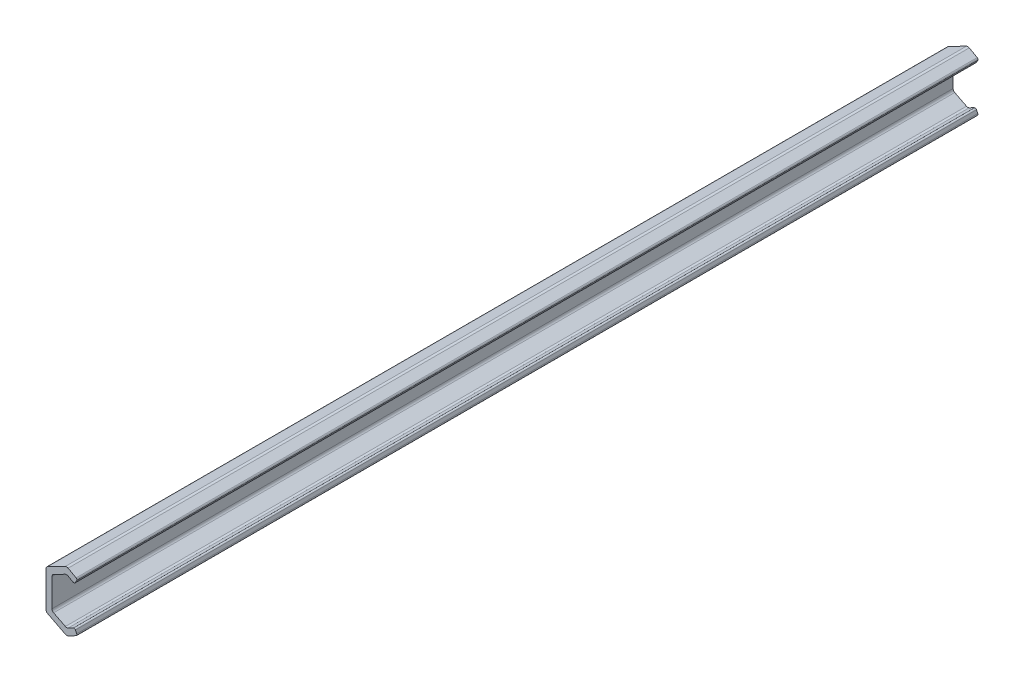
ISO-10303-21;
HEADER;
FILE_DESCRIPTION(('STEP AP214'),'2;1');
FILE_NAME('part.step','',(''),(''),'','','');
FILE_SCHEMA(('AUTOMOTIVE_DESIGN { 1 0 10303 214 1 1 1 1 }'));
ENDSEC;
DATA;
#1=APPLICATION_CONTEXT('core data for automotive mechanical design processes');
#2=APPLICATION_PROTOCOL_DEFINITION('international standard','automotive_design',2000,#1);
#3=PRODUCT_CONTEXT('',#1,'mechanical');
#4=PRODUCT('Part','Part','',(#3));
#5=PRODUCT_RELATED_PRODUCT_CATEGORY('part','',(#4));
#6=PRODUCT_DEFINITION_FORMATION('','',#4);
#7=PRODUCT_DEFINITION_CONTEXT('part definition',#1,'design');
#8=PRODUCT_DEFINITION('design','',#6,#7);
#9=PRODUCT_DEFINITION_SHAPE('','',#8);
#10=(LENGTH_UNIT() NAMED_UNIT(*) SI_UNIT(.MILLI.,.METRE.));
#11=(NAMED_UNIT(*) PLANE_ANGLE_UNIT() SI_UNIT($,.RADIAN.));
#12=(NAMED_UNIT(*) SI_UNIT($,.STERADIAN.) SOLID_ANGLE_UNIT());
#13=UNCERTAINTY_MEASURE_WITH_UNIT(LENGTH_MEASURE(1.E-05),#10,'distance_accuracy_value','');
#14=(GEOMETRIC_REPRESENTATION_CONTEXT(3) GLOBAL_UNCERTAINTY_ASSIGNED_CONTEXT((#13)) GLOBAL_UNIT_ASSIGNED_CONTEXT((#10,
#11,#12)) REPRESENTATION_CONTEXT('',''));
#15=CARTESIAN_POINT('',(0.,0.,0.));
#16=DIRECTION('',(0.,0.,1.));
#17=DIRECTION('',(1.,0.,0.));
#18=AXIS2_PLACEMENT_3D('',#15,#16,#17);
#19=CARTESIAN_POINT('',(-88.2947227276455,31.2363335950971,300.));
#20=DIRECTION('',(0.,0.,-1.));
#21=DIRECTION('',(-1.,0.,0.));
#22=AXIS2_PLACEMENT_3D('',#19,#20,#21);
#23=CYLINDRICAL_SURFACE('',#22,1.00000000000001);
#24=CARTESIAN_POINT('',(-88.2947227276455,31.2363335950971,0.));
#25=DIRECTION('',(0.,0.,1.));
#26=DIRECTION('',(1.,0.,0.));
#27=AXIS2_PLACEMENT_3D('',#24,#25,#26);
#28=CIRCLE('',#27,1.00000000000001);
#29=CARTESIAN_POINT('',(-88.7470988650902,32.128160837488,0.));
#30=VERTEX_POINT('',#29);
#31=CARTESIAN_POINT('',(-89.2947227276455,31.2363335950971,0.));
#32=VERTEX_POINT('',#31);
#33=EDGE_CURVE('E227',#30,#32,#28,.T.);
#34=ORIENTED_EDGE('',*,*,#33,.F.);
#35=DIRECTION('',(0.,0.,-1.));
#36=VECTOR('',#35,1.);
#37=CARTESIAN_POINT('',(-88.7470988650902,32.128160837488,300.));
#38=LINE('',#37,#36);
#39=CARTESIAN_POINT('',(-88.7470988650902,32.128160837488,300.));
#40=VERTEX_POINT('',#39);
#41=EDGE_CURVE('E11',#40,#30,#38,.T.);
#42=ORIENTED_EDGE('',*,*,#41,.F.);
#43=CARTESIAN_POINT('',(-88.2947227276455,31.2363335950971,300.));
#44=DIRECTION('',(0.,0.,1.));
#45=DIRECTION('',(1.,0.,0.));
#46=AXIS2_PLACEMENT_3D('',#43,#44,#45);
#47=CIRCLE('',#46,1.00000000000001);
#48=CARTESIAN_POINT('',(-89.2947227276455,31.2363335950971,300.));
#49=VERTEX_POINT('',#48);
#50=EDGE_CURVE('E288',#40,#49,#47,.T.);
#51=ORIENTED_EDGE('',*,*,#50,.T.);
#52=DIRECTION('',(0.,0.,-1.));
#53=VECTOR('',#52,1.);
#54=CARTESIAN_POINT('',(-89.2947227276455,31.2363335950971,300.));
#55=LINE('',#54,#53);
#56=EDGE_CURVE('E39',#49,#32,#55,.T.);
#57=ORIENTED_EDGE('',*,*,#56,.T.);
#58=EDGE_LOOP('',(#34,#42,#51,#57));
#59=FACE_BOUND('',#58,.T.);
#60=ADVANCED_FACE('F36',(#59),#23,.F.);
#61=CARTESIAN_POINT('',(-88.7470988650902,32.128160837488,300.));
#62=DIRECTION('',(-0.452376137444682,0.891827242390941,0.));
#63=DIRECTION('',(-0.891827242390941,-0.452376137444682,0.));
#64=AXIS2_PLACEMENT_3D('',#61,#62,#63);
#65=PLANE('',#64);
#66=DIRECTION('',(0.891827242390941,0.452376137444682,0.));
#67=VECTOR('',#66,1.);
#68=CARTESIAN_POINT('',(-88.7470988650902,32.128160837488,0.));
#69=LINE('',#68,#67);
#70=CARTESIAN_POINT('',(-84.9054833342763,34.0768063965965,0.));
#71=VERTEX_POINT('',#70);
#72=EDGE_CURVE('E287',#30,#71,#69,.T.);
#73=ORIENTED_EDGE('',*,*,#72,.T.);
#74=DIRECTION('',(0.,0.,-1.));
#75=VECTOR('',#74,1.);
#76=CARTESIAN_POINT('',(-84.9054833342763,34.0768063965965,300.));
#77=LINE('',#76,#75);
#78=CARTESIAN_POINT('',(-84.9054833342763,34.0768063965965,300.));
#79=VERTEX_POINT('',#78);
#80=EDGE_CURVE('E45',#79,#71,#77,.T.);
#81=ORIENTED_EDGE('',*,*,#80,.F.);
#82=DIRECTION('',(0.891827242390941,0.452376137444682,0.));
#83=VECTOR('',#82,1.);
#84=CARTESIAN_POINT('',(-88.7470988650902,32.128160837488,300.));
#85=LINE('',#84,#83);
#86=EDGE_CURVE('E222',#40,#79,#85,.T.);
#87=ORIENTED_EDGE('',*,*,#86,.F.);
#88=ORIENTED_EDGE('',*,*,#41,.T.);
#89=EDGE_LOOP('',(#73,#81,#87,#88));
#90=FACE_BOUND('',#89,.T.);
#91=ADVANCED_FACE('F338',(#90),#65,.F.);
#92=CARTESIAN_POINT('',(-84.4531071968316,33.1849791542056,300.));
#93=DIRECTION('',(0.,0.,-1.));
#94=DIRECTION('',(-1.,0.,0.));
#95=AXIS2_PLACEMENT_3D('',#92,#93,#94);
#96=CYLINDRICAL_SURFACE('',#95,1.);
#97=CARTESIAN_POINT('',(-84.4531071968316,33.1849791542056,0.));
#98=DIRECTION('',(0.,0.,1.));
#99=DIRECTION('',(1.,0.,0.));
#100=AXIS2_PLACEMENT_3D('',#97,#98,#99);
#101=CIRCLE('',#100,1.);
#102=CARTESIAN_POINT('',(-83.9691158121345,34.0600519166311,0.));
#103=VERTEX_POINT('',#102);
#104=EDGE_CURVE('E207',#103,#71,#101,.T.);
#105=ORIENTED_EDGE('',*,*,#104,.F.);
#106=DIRECTION('',(0.,0.,-1.));
#107=VECTOR('',#106,1.);
#108=CARTESIAN_POINT('',(-83.9691158121345,34.0600519166311,300.));
#109=LINE('',#108,#107);
#110=CARTESIAN_POINT('',(-83.9691158121345,34.0600519166311,300.));
#111=VERTEX_POINT('',#110);
#112=EDGE_CURVE('E201',#111,#103,#109,.T.);
#113=ORIENTED_EDGE('',*,*,#112,.F.);
#114=CARTESIAN_POINT('',(-84.4531071968316,33.1849791542056,300.));
#115=DIRECTION('',(0.,0.,1.));
#116=DIRECTION('',(1.,0.,0.));
#117=AXIS2_PLACEMENT_3D('',#114,#115,#116);
#118=CIRCLE('',#117,1.);
#119=EDGE_CURVE('E205',#111,#79,#118,.T.);
#120=ORIENTED_EDGE('',*,*,#119,.T.);
#121=ORIENTED_EDGE('',*,*,#80,.T.);
#122=EDGE_LOOP('',(#105,#113,#120,#121));
#123=FACE_BOUND('',#122,.T.);
#124=ADVANCED_FACE('F203',(#123),#96,.F.);
#125=CARTESIAN_POINT('',(-83.9691158121345,34.0600519166311,300.));
#126=DIRECTION('',(0.483991384697101,0.875072762425493,0.));
#127=DIRECTION('',(-0.875072762425493,0.483991384697101,0.));
#128=AXIS2_PLACEMENT_3D('',#125,#126,#127);
#129=PLANE('',#128);
#130=DIRECTION('',(0.875072762425493,-0.483991384697101,0.));
#131=VECTOR('',#130,1.);
#132=CARTESIAN_POINT('',(-83.9691158121345,34.0600519166311,0.));
#133=LINE('',#132,#131);
#134=CARTESIAN_POINT('',(-82.247884937723,33.1080614650248,0.));
#135=VERTEX_POINT('',#134);
#136=EDGE_CURVE('E284',#103,#135,#133,.T.);
#137=ORIENTED_EDGE('',*,*,#136,.T.);
#138=DIRECTION('',(0.,0.,-1.));
#139=VECTOR('',#138,1.);
#140=CARTESIAN_POINT('',(-82.247884937723,33.1080614650248,300.));
#141=LINE('',#140,#139);
#142=CARTESIAN_POINT('',(-82.247884937723,33.1080614650248,300.));
#143=VERTEX_POINT('',#142);
#144=EDGE_CURVE('E210',#143,#135,#141,.T.);
#145=ORIENTED_EDGE('',*,*,#144,.F.);
#146=DIRECTION('',(0.875072762425493,-0.483991384697101,0.));
#147=VECTOR('',#146,1.);
#148=CARTESIAN_POINT('',(-83.9691158121345,34.0600519166311,300.));
#149=LINE('',#148,#147);
#150=EDGE_CURVE('E213',#111,#143,#149,.T.);
#151=ORIENTED_EDGE('',*,*,#150,.F.);
#152=ORIENTED_EDGE('',*,*,#112,.T.);
#153=EDGE_LOOP('',(#137,#145,#151,#152));
#154=FACE_BOUND('',#153,.T.);
#155=ADVANCED_FACE('F214',(#154),#129,.F.);
#156=CARTESIAN_POINT('',(-82.0058892453745,33.5455978462375,300.));
#157=DIRECTION('',(0.,0.,-1.));
#158=DIRECTION('',(-1.,0.,0.));
#159=AXIS2_PLACEMENT_3D('',#156,#157,#158);
#160=CYLINDRICAL_SURFACE('',#159,0.499999999999997);
#161=CARTESIAN_POINT('',(-82.0058892453745,33.5455978462375,0.));
#162=DIRECTION('',(0.,0.,1.));
#163=DIRECTION('',(1.,0.,0.));
#164=AXIS2_PLACEMENT_3D('',#161,#162,#163);
#165=CIRCLE('',#164,0.499999999999997);
#166=CARTESIAN_POINT('',(-81.5683528641617,33.303602153889,0.));
#167=VERTEX_POINT('',#166);
#168=EDGE_CURVE('E281',#135,#167,#165,.T.);
#169=ORIENTED_EDGE('',*,*,#168,.T.);
#170=DIRECTION('',(0.,0.,-1.));
#171=VECTOR('',#170,1.);
#172=CARTESIAN_POINT('',(-81.5683528641617,33.303602153889,300.));
#173=LINE('',#172,#171);
#174=CARTESIAN_POINT('',(-81.5683528641617,33.303602153889,300.));
#175=VERTEX_POINT('',#174);
#176=EDGE_CURVE('E292',#175,#167,#173,.T.);
#177=ORIENTED_EDGE('',*,*,#176,.F.);
#178=CARTESIAN_POINT('',(-82.0058892453745,33.5455978462375,300.));
#179=DIRECTION('',(0.,0.,1.));
#180=DIRECTION('',(1.,0.,0.));
#181=AXIS2_PLACEMENT_3D('',#178,#179,#180);
#182=CIRCLE('',#181,0.499999999999997);
#183=EDGE_CURVE('E218',#143,#175,#182,.T.);
#184=ORIENTED_EDGE('',*,*,#183,.F.);
#185=ORIENTED_EDGE('',*,*,#144,.T.);
#186=EDGE_LOOP('',(#169,#177,#184,#185));
#187=FACE_BOUND('',#186,.T.);
#188=ADVANCED_FACE('F394',(#187),#160,.T.);
#189=CARTESIAN_POINT('',(-81.0843614794646,34.1786749163145,300.));
#190=DIRECTION('',(0.875072762425488,-0.48399138469711,0.));
#191=DIRECTION('',(0.48399138469711,0.875072762425488,0.));
#192=AXIS2_PLACEMENT_3D('',#189,#190,#191);
#193=PLANE('',#192);
#194=DIRECTION('',(-0.48399138469711,-0.875072762425488,0.));
#195=VECTOR('',#194,1.);
#196=CARTESIAN_POINT('',(-81.0843614794646,34.1786749163145,0.));
#197=LINE('',#196,#195);
#198=CARTESIAN_POINT('',(-81.0843614794646,34.1786749163145,0.));
#199=VERTEX_POINT('',#198);
#200=EDGE_CURVE('E278',#199,#167,#197,.T.);
#201=ORIENTED_EDGE('',*,*,#200,.F.);
#202=DIRECTION('',(0.,0.,-1.));
#203=VECTOR('',#202,1.);
#204=CARTESIAN_POINT('',(-81.0843614794646,34.1786749163145,300.));
#205=LINE('',#204,#203);
#206=CARTESIAN_POINT('',(-81.0843614794646,34.1786749163145,300.));
#207=VERTEX_POINT('',#206);
#208=EDGE_CURVE('E294',#207,#199,#205,.T.);
#209=ORIENTED_EDGE('',*,*,#208,.F.);
#210=DIRECTION('',(-0.48399138469711,-0.875072762425488,0.));
#211=VECTOR('',#210,1.);
#212=CARTESIAN_POINT('',(-81.0843614794646,34.1786749163145,300.));
#213=LINE('',#212,#211);
#214=EDGE_CURVE('E388',#207,#175,#213,.T.);
#215=ORIENTED_EDGE('',*,*,#214,.T.);
#216=ORIENTED_EDGE('',*,*,#176,.T.);
#217=EDGE_LOOP('',(#201,#209,#215,#216));
#218=FACE_BOUND('',#217,.T.);
#219=ADVANCED_FACE('F398',(#218),#193,.T.);
#220=CARTESIAN_POINT('',(-81.5218978606774,34.420670608663,300.));
#221=DIRECTION('',(0.,0.,-1.));
#222=DIRECTION('',(-1.,0.,0.));
#223=AXIS2_PLACEMENT_3D('',#220,#221,#222);
#224=CYLINDRICAL_SURFACE('',#223,0.499999999999999);
#225=CARTESIAN_POINT('',(-81.5218978606774,34.420670608663,0.));
#226=DIRECTION('',(0.,0.,-1.));
#227=DIRECTION('',(-1.,0.,0.));
#228=AXIS2_PLACEMENT_3D('',#225,#226,#227);
#229=CIRCLE('',#228,0.499999999999999);
#230=CARTESIAN_POINT('',(-81.2799021683288,34.8582069898758,0.));
#231=VERTEX_POINT('',#230);
#232=EDGE_CURVE('E275',#231,#199,#229,.T.);
#233=ORIENTED_EDGE('',*,*,#232,.F.);
#234=DIRECTION('',(0.,0.,-1.));
#235=VECTOR('',#234,1.);
#236=CARTESIAN_POINT('',(-81.2799021683288,34.8582069898758,300.));
#237=LINE('',#236,#235);
#238=CARTESIAN_POINT('',(-81.2799021683288,34.8582069898758,300.));
#239=VERTEX_POINT('',#238);
#240=EDGE_CURVE('E296',#239,#231,#237,.T.);
#241=ORIENTED_EDGE('',*,*,#240,.F.);
#242=CARTESIAN_POINT('',(-81.5218978606774,34.420670608663,300.));
#243=DIRECTION('',(0.,0.,-1.));
#244=DIRECTION('',(-1.,0.,0.));
#245=AXIS2_PLACEMENT_3D('',#242,#243,#244);
#246=CIRCLE('',#245,0.499999999999999);
#247=EDGE_CURVE('E385',#239,#207,#246,.T.);
#248=ORIENTED_EDGE('',*,*,#247,.T.);
#249=ORIENTED_EDGE('',*,*,#208,.T.);
#250=EDGE_LOOP('',(#233,#241,#248,#249));
#251=FACE_BOUND('',#250,.T.);
#252=ADVANCED_FACE('F401',(#251),#224,.T.);
#253=CARTESIAN_POINT('',(-83.9286215389908,36.3231792880964,300.));
#254=DIRECTION('',(0.483991384697101,0.875072762425493,0.));
#255=DIRECTION('',(-0.875072762425493,0.483991384697101,0.));
#256=AXIS2_PLACEMENT_3D('',#253,#254,#255);
#257=PLANE('',#256);
#258=DIRECTION('',(0.875072762425493,-0.483991384697101,0.));
#259=VECTOR('',#258,1.);
#260=CARTESIAN_POINT('',(-83.9286215389908,36.3231792880964,0.));
#261=LINE('',#260,#259);
#262=CARTESIAN_POINT('',(-83.9286215389908,36.3231792880964,0.));
#263=VERTEX_POINT('',#262);
#264=EDGE_CURVE('E272',#263,#231,#261,.T.);
#265=ORIENTED_EDGE('',*,*,#264,.F.);
#266=DIRECTION('',(0.,0.,-1.));
#267=VECTOR('',#266,1.);
#268=CARTESIAN_POINT('',(-83.9286215389908,36.3231792880964,300.));
#269=LINE('',#268,#267);
#270=CARTESIAN_POINT('',(-83.9286215389908,36.3231792880964,300.));
#271=VERTEX_POINT('',#270);
#272=EDGE_CURVE('E298',#271,#263,#269,.T.);
#273=ORIENTED_EDGE('',*,*,#272,.F.);
#274=DIRECTION('',(0.875072762425493,-0.483991384697101,0.));
#275=VECTOR('',#274,1.);
#276=CARTESIAN_POINT('',(-83.9286215389908,36.3231792880964,300.));
#277=LINE('',#276,#275);
#278=EDGE_CURVE('E382',#271,#239,#277,.T.);
#279=ORIENTED_EDGE('',*,*,#278,.T.);
#280=ORIENTED_EDGE('',*,*,#240,.T.);
#281=EDGE_LOOP('',(#265,#273,#279,#280));
#282=FACE_BOUND('',#281,.T.);
#283=ADVANCED_FACE('F406',(#282),#257,.T.);
#284=CARTESIAN_POINT('',(-84.4126129236879,35.4481065256709,300.));
#285=DIRECTION('',(0.,0.,-1.));
#286=DIRECTION('',(-1.,0.,0.));
#287=AXIS2_PLACEMENT_3D('',#284,#285,#286);
#288=CYLINDRICAL_SURFACE('',#287,1.);
#289=CARTESIAN_POINT('',(-84.4126129236879,35.4481065256709,0.));
#290=DIRECTION('',(0.,0.,-1.));
#291=DIRECTION('',(-1.,0.,0.));
#292=AXIS2_PLACEMENT_3D('',#289,#290,#291);
#293=CIRCLE('',#292,1.);
#294=CARTESIAN_POINT('',(-84.8649890611326,36.3399337680618,0.));
#295=VERTEX_POINT('',#294);
#296=EDGE_CURVE('E269',#295,#263,#293,.T.);
#297=ORIENTED_EDGE('',*,*,#296,.F.);
#298=DIRECTION('',(0.,0.,-1.));
#299=VECTOR('',#298,1.);
#300=CARTESIAN_POINT('',(-84.8649890611326,36.3399337680618,300.));
#301=LINE('',#300,#299);
#302=CARTESIAN_POINT('',(-84.8649890611326,36.3399337680618,300.));
#303=VERTEX_POINT('',#302);
#304=EDGE_CURVE('E300',#303,#295,#301,.T.);
#305=ORIENTED_EDGE('',*,*,#304,.F.);
#306=CARTESIAN_POINT('',(-84.4126129236879,35.4481065256709,300.));
#307=DIRECTION('',(0.,0.,-1.));
#308=DIRECTION('',(-1.,0.,0.));
#309=AXIS2_PLACEMENT_3D('',#306,#307,#308);
#310=CIRCLE('',#309,1.);
#311=EDGE_CURVE('E379',#303,#271,#310,.T.);
#312=ORIENTED_EDGE('',*,*,#311,.T.);
#313=ORIENTED_EDGE('',*,*,#272,.T.);
#314=EDGE_LOOP('',(#297,#305,#312,#313));
#315=FACE_BOUND('',#314,.T.);
#316=ADVANCED_FACE('F409',(#315),#288,.T.);
#317=CARTESIAN_POINT('',(-90.7470988650902,33.3562548819964,300.));
#318=DIRECTION('',(-0.452376137444682,0.891827242390941,0.));
#319=DIRECTION('',(-0.891827242390941,-0.452376137444682,0.));
#320=AXIS2_PLACEMENT_3D('',#317,#318,#319);
#321=PLANE('',#320);
#322=DIRECTION('',(0.891827242390941,0.452376137444682,0.));
#323=VECTOR('',#322,1.);
#324=CARTESIAN_POINT('',(-90.7470988650902,33.3562548819964,0.));
#325=LINE('',#324,#323);
#326=CARTESIAN_POINT('',(-90.7470988650902,33.3562548819964,0.));
#327=VERTEX_POINT('',#326);
#328=EDGE_CURVE('E266',#327,#295,#325,.T.);
#329=ORIENTED_EDGE('',*,*,#328,.F.);
#330=DIRECTION('',(0.,0.,-1.));
#331=VECTOR('',#330,1.);
#332=CARTESIAN_POINT('',(-90.7470988650902,33.3562548819964,300.));
#333=LINE('',#332,#331);
#334=CARTESIAN_POINT('',(-90.7470988650902,33.3562548819964,300.));
#335=VERTEX_POINT('',#334);
#336=EDGE_CURVE('E302',#335,#327,#333,.T.);
#337=ORIENTED_EDGE('',*,*,#336,.F.);
#338=DIRECTION('',(0.891827242390941,0.452376137444682,0.));
#339=VECTOR('',#338,1.);
#340=CARTESIAN_POINT('',(-90.7470988650902,33.3562548819964,300.));
#341=LINE('',#340,#339);
#342=EDGE_CURVE('E376',#335,#303,#341,.T.);
#343=ORIENTED_EDGE('',*,*,#342,.T.);
#344=ORIENTED_EDGE('',*,*,#304,.T.);
#345=EDGE_LOOP('',(#329,#337,#343,#344));
#346=FACE_BOUND('',#345,.T.);
#347=ADVANCED_FACE('F414',(#346),#321,.T.);
#348=CARTESIAN_POINT('',(-90.2947227276455,32.4644276396054,300.));
#349=DIRECTION('',(0.,0.,-1.));
#350=DIRECTION('',(-1.,0.,0.));
#351=AXIS2_PLACEMENT_3D('',#348,#349,#350);
#352=CYLINDRICAL_SURFACE('',#351,1.00000000000001);
#353=CARTESIAN_POINT('',(-90.2947227276455,32.4644276396054,0.));
#354=DIRECTION('',(0.,0.,-1.));
#355=DIRECTION('',(-1.,0.,0.));
#356=AXIS2_PLACEMENT_3D('',#353,#354,#355);
#357=CIRCLE('',#356,1.00000000000001);
#358=CARTESIAN_POINT('',(-91.2947227276455,32.4644276396054,0.));
#359=VERTEX_POINT('',#358);
#360=EDGE_CURVE('E263',#359,#327,#357,.T.);
#361=ORIENTED_EDGE('',*,*,#360,.F.);
#362=DIRECTION('',(0.,0.,-1.));
#363=VECTOR('',#362,1.);
#364=CARTESIAN_POINT('',(-91.2947227276455,32.4644276396054,300.));
#365=LINE('',#364,#363);
#366=CARTESIAN_POINT('',(-91.2947227276455,32.4644276396054,300.));
#367=VERTEX_POINT('',#366);
#368=EDGE_CURVE('E304',#367,#359,#365,.T.);
#369=ORIENTED_EDGE('',*,*,#368,.F.);
#370=CARTESIAN_POINT('',(-90.2947227276455,32.4644276396054,300.));
#371=DIRECTION('',(0.,0.,-1.));
#372=DIRECTION('',(-1.,0.,0.));
#373=AXIS2_PLACEMENT_3D('',#370,#371,#372);
#374=CIRCLE('',#373,1.00000000000001);
#375=EDGE_CURVE('E373',#367,#335,#374,.T.);
#376=ORIENTED_EDGE('',*,*,#375,.T.);
#377=ORIENTED_EDGE('',*,*,#336,.T.);
#378=EDGE_LOOP('',(#361,#369,#376,#377));
#379=FACE_BOUND('',#378,.T.);
#380=ADVANCED_FACE('F417',(#379),#352,.T.);
#381=CARTESIAN_POINT('',(-91.2947227276455,32.4644276396054,300.));
#382=DIRECTION('',(1.,0.,0.));
#383=DIRECTION('',(0.,1.,0.));
#384=AXIS2_PLACEMENT_3D('',#381,#382,#383);
#385=PLANE('',#384);
#386=DIRECTION('',(0.,-1.,0.));
#387=VECTOR('',#386,1.);
#388=CARTESIAN_POINT('',(-91.2947227276455,32.4644276396054,0.));
#389=LINE('',#388,#387);
#390=CARTESIAN_POINT('',(-91.2947227276455,20.6949127832017,0.));
#391=VERTEX_POINT('',#390);
#392=EDGE_CURVE('E261',#359,#391,#389,.T.);
#393=ORIENTED_EDGE('',*,*,#392,.T.);
#394=DIRECTION('',(0.,0.,-1.));
#395=VECTOR('',#394,1.);
#396=CARTESIAN_POINT('',(-91.2947227276455,20.6949127832017,300.));
#397=LINE('',#396,#395);
#398=CARTESIAN_POINT('',(-91.2947227276455,20.6949127832017,300.));
#399=VERTEX_POINT('',#398);
#400=EDGE_CURVE('E306',#399,#391,#397,.T.);
#401=ORIENTED_EDGE('',*,*,#400,.F.);
#402=DIRECTION('',(0.,-1.,0.));
#403=VECTOR('',#402,1.);
#404=CARTESIAN_POINT('',(-91.2947227276455,32.4644276396054,300.));
#405=LINE('',#404,#403);
#406=EDGE_CURVE('E371',#367,#399,#405,.T.);
#407=ORIENTED_EDGE('',*,*,#406,.F.);
#408=ORIENTED_EDGE('',*,*,#368,.T.);
#409=EDGE_LOOP('',(#393,#401,#407,#408));
#410=FACE_BOUND('',#409,.T.);
#411=ADVANCED_FACE('F423',(#410),#385,.F.);
#412=CARTESIAN_POINT('',(-90.2947227276455,20.6949127832017,300.));
#413=DIRECTION('',(0.,0.,-1.));
#414=DIRECTION('',(-1.,0.,0.));
#415=AXIS2_PLACEMENT_3D('',#412,#413,#414);
#416=CYLINDRICAL_SURFACE('',#415,1.);
#417=CARTESIAN_POINT('',(-90.2947227276455,20.6949127832017,0.));
#418=DIRECTION('',(0.,0.,1.));
#419=DIRECTION('',(1.,0.,0.));
#420=AXIS2_PLACEMENT_3D('',#417,#418,#419);
#421=CIRCLE('',#420,1.);
#422=CARTESIAN_POINT('',(-90.7470988650902,19.8030855408107,0.));
#423=VERTEX_POINT('',#422);
#424=EDGE_CURVE('E259',#391,#423,#421,.T.);
#425=ORIENTED_EDGE('',*,*,#424,.T.);
#426=DIRECTION('',(0.,0.,-1.));
#427=VECTOR('',#426,1.);
#428=CARTESIAN_POINT('',(-90.7470988650902,19.8030855408107,300.));
#429=LINE('',#428,#427);
#430=CARTESIAN_POINT('',(-90.7470988650902,19.8030855408107,300.));
#431=VERTEX_POINT('',#430);
#432=EDGE_CURVE('E309',#431,#423,#429,.T.);
#433=ORIENTED_EDGE('',*,*,#432,.F.);
#434=CARTESIAN_POINT('',(-90.2947227276455,20.6949127832017,300.));
#435=DIRECTION('',(0.,0.,1.));
#436=DIRECTION('',(1.,0.,0.));
#437=AXIS2_PLACEMENT_3D('',#434,#435,#436);
#438=CIRCLE('',#437,1.);
#439=EDGE_CURVE('E369',#399,#431,#438,.T.);
#440=ORIENTED_EDGE('',*,*,#439,.F.);
#441=ORIENTED_EDGE('',*,*,#400,.T.);
#442=EDGE_LOOP('',(#425,#433,#440,#441));
#443=FACE_BOUND('',#442,.T.);
#444=ADVANCED_FACE('F427',(#443),#416,.T.);
#445=CARTESIAN_POINT('',(-90.7470988650902,19.8030855408107,300.));
#446=DIRECTION('',(0.452376137444681,0.891827242390941,0.));
#447=DIRECTION('',(-0.891827242390942,0.452376137444681,0.));
#448=AXIS2_PLACEMENT_3D('',#445,#446,#447);
#449=PLANE('',#448);
#450=DIRECTION('',(0.891827242390941,-0.452376137444681,0.));
#451=VECTOR('',#450,1.);
#452=CARTESIAN_POINT('',(-90.7470988650902,19.8030855408107,0.));
#453=LINE('',#452,#451);
#454=CARTESIAN_POINT('',(-84.8447419245608,16.8091363680784,0.));
#455=VERTEX_POINT('',#454);
#456=EDGE_CURVE('E257',#423,#455,#453,.T.);
#457=ORIENTED_EDGE('',*,*,#456,.T.);
#458=DIRECTION('',(0.,0.,-1.));
#459=VECTOR('',#458,1.);
#460=CARTESIAN_POINT('',(-84.8447419245608,16.8091363680784,300.));
#461=LINE('',#460,#459);
#462=CARTESIAN_POINT('',(-84.8447419245608,16.8091363680784,300.));
#463=VERTEX_POINT('',#462);
#464=EDGE_CURVE('E312',#463,#455,#461,.T.);
#465=ORIENTED_EDGE('',*,*,#464,.F.);
#466=DIRECTION('',(0.891827242390941,-0.452376137444681,0.));
#467=VECTOR('',#466,1.);
#468=CARTESIAN_POINT('',(-90.7470988650902,19.8030855408107,300.));
#469=LINE('',#468,#467);
#470=EDGE_CURVE('E367',#431,#463,#469,.T.);
#471=ORIENTED_EDGE('',*,*,#470,.F.);
#472=ORIENTED_EDGE('',*,*,#432,.T.);
#473=EDGE_LOOP('',(#457,#465,#471,#472));
#474=FACE_BOUND('',#473,.T.);
#475=ADVANCED_FACE('F432',(#474),#449,.F.);
#476=CARTESIAN_POINT('',(-84.3923657871161,17.7009636104693,300.));
#477=DIRECTION('',(0.,0.,-1.));
#478=DIRECTION('',(-1.,0.,0.));
#479=AXIS2_PLACEMENT_3D('',#476,#477,#478);
#480=CYLINDRICAL_SURFACE('',#479,0.999999999999999);
#481=CARTESIAN_POINT('',(-84.3923657871161,17.7009636104693,0.));
#482=DIRECTION('',(0.,0.,1.));
#483=DIRECTION('',(1.,0.,0.));
#484=AXIS2_PLACEMENT_3D('',#481,#482,#483);
#485=CIRCLE('',#484,0.999999999999999);
#486=CARTESIAN_POINT('',(-83.9399896496714,16.8091363680784,0.));
#487=VERTEX_POINT('',#486);
#488=EDGE_CURVE('E255',#455,#487,#485,.T.);
#489=ORIENTED_EDGE('',*,*,#488,.T.);
#490=DIRECTION('',(0.,0.,-1.));
#491=VECTOR('',#490,1.);
#492=CARTESIAN_POINT('',(-83.9399896496714,16.8091363680784,300.));
#493=LINE('',#492,#491);
#494=CARTESIAN_POINT('',(-83.9399896496714,16.8091363680784,300.));
#495=VERTEX_POINT('',#494);
#496=EDGE_CURVE('E315',#495,#487,#493,.T.);
#497=ORIENTED_EDGE('',*,*,#496,.F.);
#498=CARTESIAN_POINT('',(-84.3923657871161,17.7009636104693,300.));
#499=DIRECTION('',(0.,0.,1.));
#500=DIRECTION('',(1.,0.,0.));
#501=AXIS2_PLACEMENT_3D('',#498,#499,#500);
#502=CIRCLE('',#501,0.999999999999999);
#503=EDGE_CURVE('E365',#463,#495,#502,.T.);
#504=ORIENTED_EDGE('',*,*,#503,.F.);
#505=ORIENTED_EDGE('',*,*,#464,.T.);
#506=EDGE_LOOP('',(#489,#497,#504,#505));
#507=FACE_BOUND('',#506,.T.);
#508=ADVANCED_FACE('F438',(#507),#480,.T.);
#509=CARTESIAN_POINT('',(-83.9399896496714,16.8091363680784,300.));
#510=DIRECTION('',(-0.45237613744468,0.891827242390942,0.));
#511=DIRECTION('',(-0.891827242390942,-0.45237613744468,0.));
#512=AXIS2_PLACEMENT_3D('',#509,#510,#511);
#513=PLANE('',#512);
#514=DIRECTION('',(0.891827242390942,0.452376137444681,0.));
#515=VECTOR('',#514,1.);
#516=CARTESIAN_POINT('',(-83.9399896496714,16.8091363680784,0.));
#517=LINE('',#516,#515);
#518=CARTESIAN_POINT('',(-81.2882794083115,18.1542067803624,0.));
#519=VERTEX_POINT('',#518);
#520=EDGE_CURVE('E253',#487,#519,#517,.T.);
#521=ORIENTED_EDGE('',*,*,#520,.T.);
#522=DIRECTION('',(0.,0.,-1.));
#523=VECTOR('',#522,1.);
#524=CARTESIAN_POINT('',(-81.2882794083115,18.1542067803624,300.));
#525=LINE('',#524,#523);
#526=CARTESIAN_POINT('',(-81.2882794083115,18.1542067803624,300.));
#527=VERTEX_POINT('',#526);
#528=EDGE_CURVE('E318',#527,#519,#525,.T.);
#529=ORIENTED_EDGE('',*,*,#528,.F.);
#530=DIRECTION('',(0.891827242390942,0.452376137444681,0.));
#531=VECTOR('',#530,1.);
#532=CARTESIAN_POINT('',(-83.9399896496714,16.8091363680784,300.));
#533=LINE('',#532,#531);
#534=EDGE_CURVE('E363',#495,#527,#533,.T.);
#535=ORIENTED_EDGE('',*,*,#534,.F.);
#536=ORIENTED_EDGE('',*,*,#496,.T.);
#537=EDGE_LOOP('',(#521,#529,#535,#536));
#538=FACE_BOUND('',#537,.T.);
#539=ADVANCED_FACE('F442',(#538),#513,.F.);
#540=CARTESIAN_POINT('',(-81.5144674770339,18.6001204015578,300.));
#541=DIRECTION('',(0.,0.,-1.));
#542=DIRECTION('',(-1.,0.,0.));
#543=AXIS2_PLACEMENT_3D('',#540,#541,#542);
#544=CYLINDRICAL_SURFACE('',#543,0.500000000000002);
#545=CARTESIAN_POINT('',(-81.5144674770339,18.6001204015578,0.));
#546=DIRECTION('',(0.,0.,1.));
#547=DIRECTION('',(1.,0.,0.));
#548=AXIS2_PLACEMENT_3D('',#545,#546,#547);
#549=CIRCLE('',#548,0.500000000000002);
#550=CARTESIAN_POINT('',(-81.0685538558384,18.8263084702802,0.));
#551=VERTEX_POINT('',#550);
#552=EDGE_CURVE('E251',#519,#551,#549,.T.);
#553=ORIENTED_EDGE('',*,*,#552,.T.);
#554=DIRECTION('',(0.,0.,-1.));
#555=VECTOR('',#554,1.);
#556=CARTESIAN_POINT('',(-81.0685538558384,18.8263084702802,300.));
#557=LINE('',#556,#555);
#558=CARTESIAN_POINT('',(-81.0685538558384,18.8263084702802,300.));
#559=VERTEX_POINT('',#558);
#560=EDGE_CURVE('E321',#559,#551,#557,.T.);
#561=ORIENTED_EDGE('',*,*,#560,.F.);
#562=CARTESIAN_POINT('',(-81.5144674770339,18.6001204015578,300.));
#563=DIRECTION('',(0.,0.,1.));
#564=DIRECTION('',(1.,0.,0.));
#565=AXIS2_PLACEMENT_3D('',#562,#563,#564);
#566=CIRCLE('',#565,0.500000000000002);
#567=EDGE_CURVE('E361',#527,#559,#566,.T.);
#568=ORIENTED_EDGE('',*,*,#567,.F.);
#569=ORIENTED_EDGE('',*,*,#528,.T.);
#570=EDGE_LOOP('',(#553,#561,#568,#569));
#571=FACE_BOUND('',#570,.T.);
#572=ADVANCED_FACE('F447',(#571),#544,.T.);
#573=CARTESIAN_POINT('',(-81.0685538558384,18.8263084702802,300.));
#574=DIRECTION('',(-0.891827242390945,-0.452376137444674,0.));
#575=DIRECTION('',(0.452376137444674,-0.891827242390945,0.));
#576=AXIS2_PLACEMENT_3D('',#573,#574,#575);
#577=PLANE('',#576);
#578=DIRECTION('',(-0.452376137444674,0.891827242390945,0.));
#579=VECTOR('',#578,1.);
#580=CARTESIAN_POINT('',(-81.0685538558384,18.8263084702802,0.));
#581=LINE('',#580,#579);
#582=CARTESIAN_POINT('',(-81.5209299932831,19.7181357126711,0.));
#583=VERTEX_POINT('',#582);
#584=EDGE_CURVE('E248',#551,#583,#581,.T.);
#585=ORIENTED_EDGE('',*,*,#584,.T.);
#586=DIRECTION('',(0.,0.,-1.));
#587=VECTOR('',#586,1.);
#588=CARTESIAN_POINT('',(-81.5209299932831,19.7181357126711,300.));
#589=LINE('',#588,#587);
#590=CARTESIAN_POINT('',(-81.5209299932831,19.7181357126711,300.));
#591=VERTEX_POINT('',#590);
#592=EDGE_CURVE('E324',#591,#583,#589,.T.);
#593=ORIENTED_EDGE('',*,*,#592,.F.);
#594=DIRECTION('',(-0.452376137444674,0.891827242390945,0.));
#595=VECTOR('',#594,1.);
#596=CARTESIAN_POINT('',(-81.0685538558384,18.8263084702802,300.));
#597=LINE('',#596,#595);
#598=EDGE_CURVE('E359',#559,#591,#597,.T.);
#599=ORIENTED_EDGE('',*,*,#598,.F.);
#600=ORIENTED_EDGE('',*,*,#560,.T.);
#601=EDGE_LOOP('',(#585,#593,#599,#600));
#602=FACE_BOUND('',#601,.T.);
#603=ADVANCED_FACE('F453',(#602),#577,.F.);
#604=CARTESIAN_POINT('',(-81.9668436144785,19.4919476439488,300.));
#605=DIRECTION('',(0.,0.,-1.));
#606=DIRECTION('',(-1.,0.,0.));
#607=AXIS2_PLACEMENT_3D('',#604,#605,#606);
#608=CYLINDRICAL_SURFACE('',#607,0.499999999999999);
#609=CARTESIAN_POINT('',(-81.9668436144785,19.4919476439488,0.));
#610=DIRECTION('',(0.,0.,-1.));
#611=DIRECTION('',(-1.,0.,0.));
#612=AXIS2_PLACEMENT_3D('',#609,#610,#611);
#613=CIRCLE('',#612,0.499999999999999);
#614=CARTESIAN_POINT('',(-82.1930316832009,19.9378612651442,0.));
#615=VERTEX_POINT('',#614);
#616=EDGE_CURVE('E245',#615,#583,#613,.T.);
#617=ORIENTED_EDGE('',*,*,#616,.F.);
#618=DIRECTION('',(0.,0.,-1.));
#619=VECTOR('',#618,1.);
#620=CARTESIAN_POINT('',(-82.1930316832009,19.9378612651442,300.));
#621=LINE('',#620,#619);
#622=CARTESIAN_POINT('',(-82.1930316832009,19.9378612651442,300.));
#623=VERTEX_POINT('',#622);
#624=EDGE_CURVE('E326',#623,#615,#621,.T.);
#625=ORIENTED_EDGE('',*,*,#624,.F.);
#626=CARTESIAN_POINT('',(-81.9668436144785,19.4919476439488,300.));
#627=DIRECTION('',(0.,0.,-1.));
#628=DIRECTION('',(-1.,0.,0.));
#629=AXIS2_PLACEMENT_3D('',#626,#627,#628);
#630=CIRCLE('',#629,0.499999999999999);
#631=EDGE_CURVE('E356',#623,#591,#630,.T.);
#632=ORIENTED_EDGE('',*,*,#631,.T.);
#633=ORIENTED_EDGE('',*,*,#592,.T.);
#634=EDGE_LOOP('',(#617,#625,#632,#633));
#635=FACE_BOUND('',#634,.T.);
#636=ADVANCED_FACE('F457',(#635),#608,.T.);
#637=CARTESIAN_POINT('',(-83.9399896496714,19.0517231662099,300.));
#638=DIRECTION('',(-0.452376137444676,0.891827242390944,0.));
#639=DIRECTION('',(-0.891827242390944,-0.452376137444676,0.));
#640=AXIS2_PLACEMENT_3D('',#637,#638,#639);
#641=PLANE('',#640);
#642=DIRECTION('',(0.891827242390944,0.452376137444676,0.));
#643=VECTOR('',#642,1.);
#644=CARTESIAN_POINT('',(-83.9399896496714,19.0517231662099,0.));
#645=LINE('',#644,#643);
#646=CARTESIAN_POINT('',(-83.9399896496714,19.0517231662099,0.));
#647=VERTEX_POINT('',#646);
#648=EDGE_CURVE('E242',#647,#615,#645,.T.);
#649=ORIENTED_EDGE('',*,*,#648,.F.);
#650=DIRECTION('',(0.,0.,-1.));
#651=VECTOR('',#650,1.);
#652=CARTESIAN_POINT('',(-83.9399896496714,19.0517231662099,300.));
#653=LINE('',#652,#651);
#654=CARTESIAN_POINT('',(-83.9399896496714,19.0517231662099,300.));
#655=VERTEX_POINT('',#654);
#656=EDGE_CURVE('E328',#655,#647,#653,.T.);
#657=ORIENTED_EDGE('',*,*,#656,.F.);
#658=DIRECTION('',(0.891827242390944,0.452376137444676,0.));
#659=VECTOR('',#658,1.);
#660=CARTESIAN_POINT('',(-83.9399896496714,19.0517231662099,300.));
#661=LINE('',#660,#659);
#662=EDGE_CURVE('E353',#655,#623,#661,.T.);
#663=ORIENTED_EDGE('',*,*,#662,.T.);
#664=ORIENTED_EDGE('',*,*,#624,.T.);
#665=EDGE_LOOP('',(#649,#657,#663,#664));
#666=FACE_BOUND('',#665,.T.);
#667=ADVANCED_FACE('F460',(#666),#641,.T.);
#668=CARTESIAN_POINT('',(-84.3923657871161,19.9435504086009,300.));
#669=DIRECTION('',(0.,0.,-1.));
#670=DIRECTION('',(-1.,0.,0.));
#671=AXIS2_PLACEMENT_3D('',#668,#669,#670);
#672=CYLINDRICAL_SURFACE('',#671,0.999999999999999);
#673=CARTESIAN_POINT('',(-84.3923657871161,19.9435504086009,0.));
#674=DIRECTION('',(0.,0.,1.));
#675=DIRECTION('',(1.,0.,0.));
#676=AXIS2_PLACEMENT_3D('',#673,#674,#675);
#677=CIRCLE('',#676,0.999999999999999);
#678=CARTESIAN_POINT('',(-84.8447419245608,19.0517231662099,0.));
#679=VERTEX_POINT('',#678);
#680=EDGE_CURVE('E239',#679,#647,#677,.T.);
#681=ORIENTED_EDGE('',*,*,#680,.F.);
#682=DIRECTION('',(0.,0.,-1.));
#683=VECTOR('',#682,1.);
#684=CARTESIAN_POINT('',(-84.8447419245608,19.0517231662099,300.));
#685=LINE('',#684,#683);
#686=CARTESIAN_POINT('',(-84.8447419245608,19.0517231662099,300.));
#687=VERTEX_POINT('',#686);
#688=EDGE_CURVE('E330',#687,#679,#685,.T.);
#689=ORIENTED_EDGE('',*,*,#688,.F.);
#690=CARTESIAN_POINT('',(-84.3923657871161,19.9435504086009,300.));
#691=DIRECTION('',(0.,0.,1.));
#692=DIRECTION('',(1.,0.,0.));
#693=AXIS2_PLACEMENT_3D('',#690,#691,#692);
#694=CIRCLE('',#693,0.999999999999999);
#695=EDGE_CURVE('E350',#687,#655,#694,.T.);
#696=ORIENTED_EDGE('',*,*,#695,.T.);
#697=ORIENTED_EDGE('',*,*,#656,.T.);
#698=EDGE_LOOP('',(#681,#689,#696,#697));
#699=FACE_BOUND('',#698,.T.);
#700=ADVANCED_FACE('F465',(#699),#672,.F.);
#701=CARTESIAN_POINT('',(-88.7470988650902,21.0311795853191,300.));
#702=DIRECTION('',(0.452376137444681,0.891827242390942,0.));
#703=DIRECTION('',(-0.891827242390942,0.452376137444681,0.));
#704=AXIS2_PLACEMENT_3D('',#701,#702,#703);
#705=PLANE('',#704);
#706=DIRECTION('',(0.891827242390942,-0.452376137444681,0.));
#707=VECTOR('',#706,1.);
#708=CARTESIAN_POINT('',(-88.7470988650902,21.0311795853191,0.));
#709=LINE('',#708,#707);
#710=CARTESIAN_POINT('',(-88.7470988650902,21.0311795853191,0.));
#711=VERTEX_POINT('',#710);
#712=EDGE_CURVE('E236',#711,#679,#709,.T.);
#713=ORIENTED_EDGE('',*,*,#712,.F.);
#714=DIRECTION('',(0.,0.,-1.));
#715=VECTOR('',#714,1.);
#716=CARTESIAN_POINT('',(-88.7470988650902,21.0311795853191,300.));
#717=LINE('',#716,#715);
#718=CARTESIAN_POINT('',(-88.7470988650902,21.0311795853191,300.));
#719=VERTEX_POINT('',#718);
#720=EDGE_CURVE('E332',#719,#711,#717,.T.);
#721=ORIENTED_EDGE('',*,*,#720,.F.);
#722=DIRECTION('',(0.891827242390942,-0.452376137444681,0.));
#723=VECTOR('',#722,1.);
#724=CARTESIAN_POINT('',(-88.7470988650902,21.0311795853191,300.));
#725=LINE('',#724,#723);
#726=EDGE_CURVE('E347',#719,#687,#725,.T.);
#727=ORIENTED_EDGE('',*,*,#726,.T.);
#728=ORIENTED_EDGE('',*,*,#688,.T.);
#729=EDGE_LOOP('',(#713,#721,#727,#728));
#730=FACE_BOUND('',#729,.T.);
#731=ADVANCED_FACE('F468',(#730),#705,.T.);
#732=CARTESIAN_POINT('',(-88.2947227276455,21.92300682771,300.));
#733=DIRECTION('',(0.,0.,-1.));
#734=DIRECTION('',(-1.,0.,0.));
#735=AXIS2_PLACEMENT_3D('',#732,#733,#734);
#736=CYLINDRICAL_SURFACE('',#735,1.);
#737=CARTESIAN_POINT('',(-88.2947227276455,21.92300682771,0.));
#738=DIRECTION('',(0.,0.,1.));
#739=DIRECTION('',(1.,0.,0.));
#740=AXIS2_PLACEMENT_3D('',#737,#738,#739);
#741=CIRCLE('',#740,1.);
#742=CARTESIAN_POINT('',(-89.2947227276455,21.92300682771,0.));
#743=VERTEX_POINT('',#742);
#744=EDGE_CURVE('E233',#743,#711,#741,.T.);
#745=ORIENTED_EDGE('',*,*,#744,.F.);
#746=DIRECTION('',(0.,0.,-1.));
#747=VECTOR('',#746,1.);
#748=CARTESIAN_POINT('',(-89.2947227276455,21.92300682771,300.));
#749=LINE('',#748,#747);
#750=CARTESIAN_POINT('',(-89.2947227276455,21.92300682771,300.));
#751=VERTEX_POINT('',#750);
#752=EDGE_CURVE('E333',#751,#743,#749,.T.);
#753=ORIENTED_EDGE('',*,*,#752,.F.);
#754=CARTESIAN_POINT('',(-88.2947227276455,21.92300682771,300.));
#755=DIRECTION('',(0.,0.,1.));
#756=DIRECTION('',(1.,0.,0.));
#757=AXIS2_PLACEMENT_3D('',#754,#755,#756);
#758=CIRCLE('',#757,1.);
#759=EDGE_CURVE('E342',#751,#719,#758,.T.);
#760=ORIENTED_EDGE('',*,*,#759,.T.);
#761=ORIENTED_EDGE('',*,*,#720,.T.);
#762=EDGE_LOOP('',(#745,#753,#760,#761));
#763=FACE_BOUND('',#762,.T.);
#764=ADVANCED_FACE('F470',(#763),#736,.F.);
#765=CARTESIAN_POINT('',(-89.2947227276455,31.2363335950971,300.));
#766=DIRECTION('',(1.,0.,0.));
#767=DIRECTION('',(0.,1.,0.));
#768=AXIS2_PLACEMENT_3D('',#765,#766,#767);
#769=PLANE('',#768);
#770=DIRECTION('',(0.,-1.,0.));
#771=VECTOR('',#770,1.);
#772=CARTESIAN_POINT('',(-89.2947227276455,31.2363335950971,0.));
#773=LINE('',#772,#771);
#774=EDGE_CURVE('E230',#32,#743,#773,.T.);
#775=ORIENTED_EDGE('',*,*,#774,.F.);
#776=ORIENTED_EDGE('',*,*,#56,.F.);
#777=DIRECTION('',(0.,-1.,0.));
#778=VECTOR('',#777,1.);
#779=CARTESIAN_POINT('',(-89.2947227276455,31.2363335950971,300.));
#780=LINE('',#779,#778);
#781=EDGE_CURVE('E340',#49,#751,#780,.T.);
#782=ORIENTED_EDGE('',*,*,#781,.T.);
#783=ORIENTED_EDGE('',*,*,#752,.T.);
#784=EDGE_LOOP('',(#775,#776,#782,#783));
#785=FACE_BOUND('',#784,.T.);
#786=ADVANCED_FACE('F335',(#785),#769,.T.);
#787=CARTESIAN_POINT('',(-88.2947227276455,31.2363335950971,300.));
#788=DIRECTION('',(0.,0.,1.));
#789=DIRECTION('',(1.,0.,0.));
#790=AXIS2_PLACEMENT_3D('',#787,#788,#789);
#791=PLANE('',#790);
#792=ORIENTED_EDGE('',*,*,#50,.F.);
#793=ORIENTED_EDGE('',*,*,#86,.T.);
#794=ORIENTED_EDGE('',*,*,#119,.F.);
#795=ORIENTED_EDGE('',*,*,#150,.T.);
#796=ORIENTED_EDGE('',*,*,#183,.T.);
#797=ORIENTED_EDGE('',*,*,#214,.F.);
#798=ORIENTED_EDGE('',*,*,#247,.F.);
#799=ORIENTED_EDGE('',*,*,#278,.F.);
#800=ORIENTED_EDGE('',*,*,#311,.F.);
#801=ORIENTED_EDGE('',*,*,#342,.F.);
#802=ORIENTED_EDGE('',*,*,#375,.F.);
#803=ORIENTED_EDGE('',*,*,#406,.T.);
#804=ORIENTED_EDGE('',*,*,#439,.T.);
#805=ORIENTED_EDGE('',*,*,#470,.T.);
#806=ORIENTED_EDGE('',*,*,#503,.T.);
#807=ORIENTED_EDGE('',*,*,#534,.T.);
#808=ORIENTED_EDGE('',*,*,#567,.T.);
#809=ORIENTED_EDGE('',*,*,#598,.T.);
#810=ORIENTED_EDGE('',*,*,#631,.F.);
#811=ORIENTED_EDGE('',*,*,#662,.F.);
#812=ORIENTED_EDGE('',*,*,#695,.F.);
#813=ORIENTED_EDGE('',*,*,#726,.F.);
#814=ORIENTED_EDGE('',*,*,#759,.F.);
#815=ORIENTED_EDGE('',*,*,#781,.F.);
#816=EDGE_LOOP('',(#792,#793,#794,#795,#796,#797,#798,#799,#800,#801,#802,#803,#804,#805,#806,
#807,#808,#809,#810,#811,#812,#813,#814,#815));
#817=FACE_BOUND('',#816,.T.);
#818=ADVANCED_FACE('F221',(#817),#791,.T.);
#819=CARTESIAN_POINT('',(-88.2947227276455,31.2363335950971,0.));
#820=DIRECTION('',(0.,0.,1.));
#821=DIRECTION('',(1.,0.,0.));
#822=AXIS2_PLACEMENT_3D('',#819,#820,#821);
#823=PLANE('',#822);
#824=ORIENTED_EDGE('',*,*,#33,.T.);
#825=ORIENTED_EDGE('',*,*,#774,.T.);
#826=ORIENTED_EDGE('',*,*,#744,.T.);
#827=ORIENTED_EDGE('',*,*,#712,.T.);
#828=ORIENTED_EDGE('',*,*,#680,.T.);
#829=ORIENTED_EDGE('',*,*,#648,.T.);
#830=ORIENTED_EDGE('',*,*,#616,.T.);
#831=ORIENTED_EDGE('',*,*,#584,.F.);
#832=ORIENTED_EDGE('',*,*,#552,.F.);
#833=ORIENTED_EDGE('',*,*,#520,.F.);
#834=ORIENTED_EDGE('',*,*,#488,.F.);
#835=ORIENTED_EDGE('',*,*,#456,.F.);
#836=ORIENTED_EDGE('',*,*,#424,.F.);
#837=ORIENTED_EDGE('',*,*,#392,.F.);
#838=ORIENTED_EDGE('',*,*,#360,.T.);
#839=ORIENTED_EDGE('',*,*,#328,.T.);
#840=ORIENTED_EDGE('',*,*,#296,.T.);
#841=ORIENTED_EDGE('',*,*,#264,.T.);
#842=ORIENTED_EDGE('',*,*,#232,.T.);
#843=ORIENTED_EDGE('',*,*,#200,.T.);
#844=ORIENTED_EDGE('',*,*,#168,.F.);
#845=ORIENTED_EDGE('',*,*,#136,.F.);
#846=ORIENTED_EDGE('',*,*,#104,.T.);
#847=ORIENTED_EDGE('',*,*,#72,.F.);
#848=EDGE_LOOP('',(#824,#825,#826,#827,#828,#829,#830,#831,#832,#833,#834,#835,#836,#837,#838,
#839,#840,#841,#842,#843,#844,#845,#846,#847));
#849=FACE_BOUND('',#848,.T.);
#850=ADVANCED_FACE('F337',(#849),#823,.F.);
#851=CLOSED_SHELL('',(#60,#91,#124,#155,#188,#219,#252,#283,#316,#347,#380,#411,#444,#475,#508,
#539,#572,#603,#636,#667,#700,#731,#764,#786,#818,#850));
#852=MANIFOLD_SOLID_BREP('B2',#851);
#853=ADVANCED_BREP_SHAPE_REPRESENTATION('',(#18,#852),#14);
#854=SHAPE_DEFINITION_REPRESENTATION(#9,#853);
ENDSEC;
END-ISO-10303-21;
